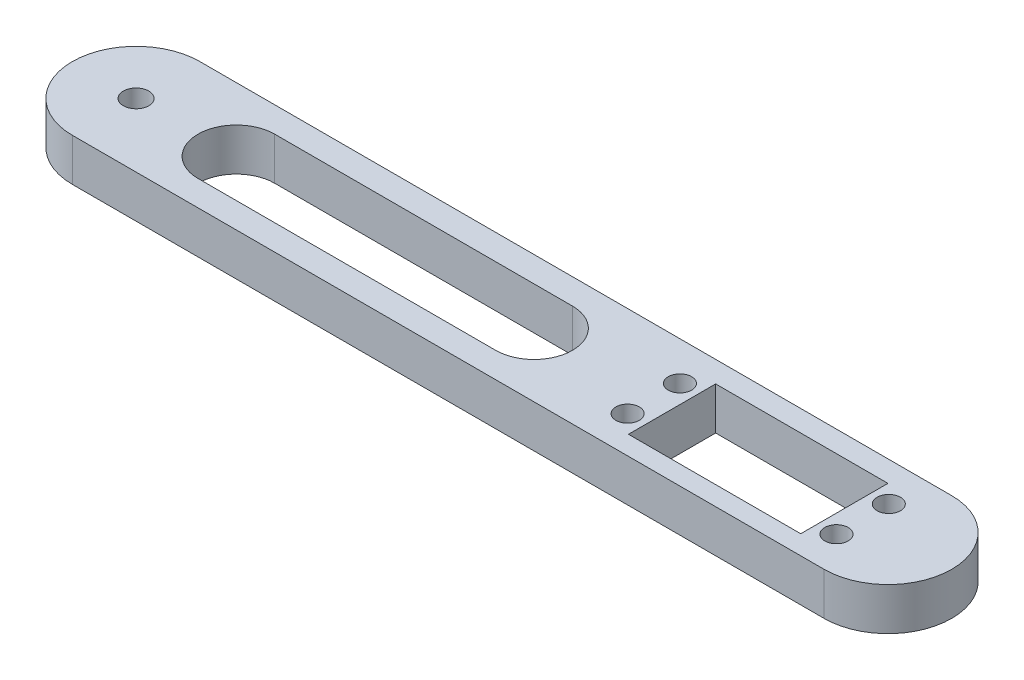
ISO-10303-21;
HEADER;
FILE_DESCRIPTION(('STEP AP214'),'2;1');
FILE_NAME('part.step','',(''),(''),'','','');
FILE_SCHEMA(('AUTOMOTIVE_DESIGN { 1 0 10303 214 1 1 1 1 }'));
ENDSEC;
DATA;
#1=APPLICATION_CONTEXT('core data for automotive mechanical design processes');
#2=APPLICATION_PROTOCOL_DEFINITION('international standard','automotive_design',2000,#1);
#3=PRODUCT_CONTEXT('',#1,'mechanical');
#4=PRODUCT('Part','Part','',(#3));
#5=PRODUCT_RELATED_PRODUCT_CATEGORY('part','',(#4));
#6=PRODUCT_DEFINITION_FORMATION('','',#4);
#7=PRODUCT_DEFINITION_CONTEXT('part definition',#1,'design');
#8=PRODUCT_DEFINITION('design','',#6,#7);
#9=PRODUCT_DEFINITION_SHAPE('','',#8);
#10=(LENGTH_UNIT() NAMED_UNIT(*) SI_UNIT(.MILLI.,.METRE.));
#11=(NAMED_UNIT(*) PLANE_ANGLE_UNIT() SI_UNIT($,.RADIAN.));
#12=(NAMED_UNIT(*) SI_UNIT($,.STERADIAN.) SOLID_ANGLE_UNIT());
#13=UNCERTAINTY_MEASURE_WITH_UNIT(LENGTH_MEASURE(1.E-05),#10,'distance_accuracy_value','');
#14=(GEOMETRIC_REPRESENTATION_CONTEXT(3) GLOBAL_UNCERTAINTY_ASSIGNED_CONTEXT((#13)) GLOBAL_UNIT_ASSIGNED_CONTEXT((#10,
#11,#12)) REPRESENTATION_CONTEXT('',''));
#15=CARTESIAN_POINT('',(0.,0.,0.));
#16=DIRECTION('',(0.,0.,1.));
#17=DIRECTION('',(1.,0.,0.));
#18=AXIS2_PLACEMENT_3D('',#15,#16,#17);
#19=CARTESIAN_POINT('',(0.,10.,0.));
#20=DIRECTION('',(0.,1.,0.));
#21=DIRECTION('',(0.,0.,1.));
#22=AXIS2_PLACEMENT_3D('',#19,#20,#21);
#23=PLANE('',#22);
#24=CARTESIAN_POINT('',(45.2012500312515,10.,-5.9));
#25=DIRECTION('',(0.,1.,0.));
#26=DIRECTION('',(0.,0.,1.));
#27=AXIS2_PLACEMENT_3D('',#24,#25,#26);
#28=CIRCLE('',#27,2.75);
#29=CARTESIAN_POINT('',(45.2012500312515,10.,-3.15));
#30=VERTEX_POINT('',#29);
#31=EDGE_CURVE('E380',#30,#30,#28,.T.);
#32=ORIENTED_EDGE('',*,*,#31,.F.);
#33=EDGE_LOOP('',(#32));
#34=FACE_BOUND('',#33,.T.);
#35=CARTESIAN_POINT('',(45.2012500312515,10.,6.4));
#36=DIRECTION('',(0.,1.,0.));
#37=DIRECTION('',(0.,0.,1.));
#38=AXIS2_PLACEMENT_3D('',#35,#36,#37);
#39=CIRCLE('',#38,2.75);
#40=CARTESIAN_POINT('',(45.2012500312515,10.,9.15));
#41=VERTEX_POINT('',#40);
#42=EDGE_CURVE('E157',#41,#41,#39,.T.);
#43=ORIENTED_EDGE('',*,*,#42,.F.);
#44=EDGE_LOOP('',(#43));
#45=FACE_BOUND('',#44,.T.);
#46=DIRECTION('',(0.,0.,1.));
#47=VECTOR('',#46,1.);
#48=CARTESIAN_POINT('',(49.5012500312515,10.,-10.));
#49=LINE('',#48,#47);
#50=CARTESIAN_POINT('',(49.5012500312515,10.,-10.));
#51=VERTEX_POINT('',#50);
#52=CARTESIAN_POINT('',(49.5012500312516,10.,10.5));
#53=VERTEX_POINT('',#52);
#54=EDGE_CURVE('E55',#51,#53,#49,.T.);
#55=ORIENTED_EDGE('',*,*,#54,.F.);
#56=DIRECTION('',(-1.,0.,0.));
#57=VECTOR('',#56,1.);
#58=CARTESIAN_POINT('',(49.5012500312515,10.,-10.));
#59=LINE('',#58,#57);
#60=CARTESIAN_POINT('',(90.0012500312516,10.,-10.));
#61=VERTEX_POINT('',#60);
#62=EDGE_CURVE('E150',#61,#51,#59,.T.);
#63=ORIENTED_EDGE('',*,*,#62,.F.);
#64=DIRECTION('',(0.,0.,-1.));
#65=VECTOR('',#64,1.);
#66=CARTESIAN_POINT('',(90.0012500312516,10.,-10.));
#67=LINE('',#66,#65);
#68=CARTESIAN_POINT('',(90.0012500312516,10.,10.5));
#69=VERTEX_POINT('',#68);
#70=EDGE_CURVE('E154',#69,#61,#67,.T.);
#71=ORIENTED_EDGE('',*,*,#70,.F.);
#72=DIRECTION('',(1.,0.,0.));
#73=VECTOR('',#72,1.);
#74=CARTESIAN_POINT('',(49.5012500312516,10.,10.5));
#75=LINE('',#74,#73);
#76=EDGE_CURVE('E166',#53,#69,#75,.T.);
#77=ORIENTED_EDGE('',*,*,#76,.F.);
#78=EDGE_LOOP('',(#55,#63,#71,#77));
#79=FACE_BOUND('',#78,.T.);
#80=CARTESIAN_POINT('',(94.3012500312516,10.,-5.9));
#81=DIRECTION('',(0.,1.,0.));
#82=DIRECTION('',(0.,0.,1.));
#83=AXIS2_PLACEMENT_3D('',#80,#81,#82);
#84=CIRCLE('',#83,2.75000000000001);
#85=CARTESIAN_POINT('',(94.3012500312516,10.,-3.14999999999999));
#86=VERTEX_POINT('',#85);
#87=EDGE_CURVE('E185',#86,#86,#84,.T.);
#88=ORIENTED_EDGE('',*,*,#87,.F.);
#89=EDGE_LOOP('',(#88));
#90=FACE_BOUND('',#89,.T.);
#91=CARTESIAN_POINT('',(94.3012500312516,10.,6.4));
#92=DIRECTION('',(0.,1.,0.));
#93=DIRECTION('',(0.,0.,1.));
#94=AXIS2_PLACEMENT_3D('',#91,#92,#93);
#95=CIRCLE('',#94,2.75000000000001);
#96=CARTESIAN_POINT('',(94.3012500312516,10.,9.15000000000001));
#97=VERTEX_POINT('',#96);
#98=EDGE_CURVE('E193',#97,#97,#95,.T.);
#99=ORIENTED_EDGE('',*,*,#98,.F.);
#100=EDGE_LOOP('',(#99));
#101=FACE_BOUND('',#100,.T.);
#102=CARTESIAN_POINT('',(-76.7563514393824,10.,0.));
#103=DIRECTION('',(0.,1.,0.));
#104=DIRECTION('',(0.,0.,1.));
#105=AXIS2_PLACEMENT_3D('',#102,#103,#104);
#106=CIRCLE('',#105,3.00000000000001);
#107=CARTESIAN_POINT('',(-76.7563514393824,10.,3.00000000000001));
#108=VERTEX_POINT('',#107);
#109=EDGE_CURVE('E176',#108,#108,#106,.T.);
#110=ORIENTED_EDGE('',*,*,#109,.F.);
#111=EDGE_LOOP('',(#110));
#112=FACE_BOUND('',#111,.T.);
#113=CARTESIAN_POINT('',(-53.1808797610856,10.,0.));
#114=DIRECTION('',(0.,1.,0.));
#115=DIRECTION('',(0.,0.,1.));
#116=AXIS2_PLACEMENT_3D('',#113,#114,#115);
#117=CIRCLE('',#116,9.01817655626148);
#118=CARTESIAN_POINT('',(-53.1808797610856,10.,-9.01817655626148));
#119=VERTEX_POINT('',#118);
#120=CARTESIAN_POINT('',(-53.1808797610856,10.,9.01817655626148));
#121=VERTEX_POINT('',#120);
#122=EDGE_CURVE('E202',#119,#121,#117,.T.);
#123=ORIENTED_EDGE('',*,*,#122,.F.);
#124=DIRECTION('',(-1.,0.,0.));
#125=VECTOR('',#124,1.);
#126=CARTESIAN_POINT('',(-53.1808797610856,10.,-9.01817655626148));
#127=LINE('',#126,#125);
#128=CARTESIAN_POINT('',(16.8191202389144,10.,-9.01817655626148));
#129=VERTEX_POINT('',#128);
#130=EDGE_CURVE('E211',#129,#119,#127,.T.);
#131=ORIENTED_EDGE('',*,*,#130,.F.);
#132=CARTESIAN_POINT('',(16.8191202389144,10.,0.));
#133=DIRECTION('',(0.,1.,0.));
#134=DIRECTION('',(0.,0.,1.));
#135=AXIS2_PLACEMENT_3D('',#132,#133,#134);
#136=CIRCLE('',#135,9.01817655626148);
#137=CARTESIAN_POINT('',(16.8191202389144,10.,9.01817655626148));
#138=VERTEX_POINT('',#137);
#139=EDGE_CURVE('E230',#138,#129,#136,.T.);
#140=ORIENTED_EDGE('',*,*,#139,.F.);
#141=DIRECTION('',(1.,0.,0.));
#142=VECTOR('',#141,1.);
#143=CARTESIAN_POINT('',(-53.1808797610856,10.,9.01817655626148));
#144=LINE('',#143,#142);
#145=EDGE_CURVE('E226',#121,#138,#144,.T.);
#146=ORIENTED_EDGE('',*,*,#145,.F.);
#147=EDGE_LOOP('',(#123,#131,#140,#146));
#148=FACE_BOUND('',#147,.T.);
#149=DIRECTION('',(-1.,0.,0.));
#150=VECTOR('',#149,1.);
#151=CARTESIAN_POINT('',(0.,10.,-15.));
#152=LINE('',#151,#150);
#153=CARTESIAN_POINT('',(100.,10.,-15.));
#154=VERTEX_POINT('',#153);
#155=CARTESIAN_POINT('',(-76.7563514393824,10.,-15.));
#156=VERTEX_POINT('',#155);
#157=EDGE_CURVE('E273',#154,#156,#152,.T.);
#158=ORIENTED_EDGE('',*,*,#157,.T.);
#159=CARTESIAN_POINT('',(-76.7563514393824,10.,0.));
#160=DIRECTION('',(0.,1.,0.));
#161=DIRECTION('',(0.,0.,1.));
#162=AXIS2_PLACEMENT_3D('',#159,#160,#161);
#163=CIRCLE('',#162,15.);
#164=CARTESIAN_POINT('',(-76.7563514393824,10.,15.));
#165=VERTEX_POINT('',#164);
#166=EDGE_CURVE('E240',#156,#165,#163,.T.);
#167=ORIENTED_EDGE('',*,*,#166,.T.);
#168=DIRECTION('',(1.,0.,0.));
#169=VECTOR('',#168,1.);
#170=CARTESIAN_POINT('',(0.,10.,15.));
#171=LINE('',#170,#169);
#172=CARTESIAN_POINT('',(100.,10.,15.));
#173=VERTEX_POINT('',#172);
#174=EDGE_CURVE('E266',#165,#173,#171,.T.);
#175=ORIENTED_EDGE('',*,*,#174,.T.);
#176=CARTESIAN_POINT('',(100.,10.,0.));
#177=DIRECTION('',(0.,1.,0.));
#178=DIRECTION('',(0.,0.,1.));
#179=AXIS2_PLACEMENT_3D('',#176,#177,#178);
#180=CIRCLE('',#179,15.);
#181=EDGE_CURVE('E269',#173,#154,#180,.T.);
#182=ORIENTED_EDGE('',*,*,#181,.T.);
#183=EDGE_LOOP('',(#158,#167,#175,#182));
#184=FACE_BOUND('',#183,.T.);
#185=ADVANCED_FACE('F39',(#34,#45,#79,#90,#101,#112,#148,#184),#23,.T.);
#186=CARTESIAN_POINT('',(0.,0.,0.));
#187=DIRECTION('',(0.,1.,0.));
#188=DIRECTION('',(0.,0.,1.));
#189=AXIS2_PLACEMENT_3D('',#186,#187,#188);
#190=PLANE('',#189);
#191=CARTESIAN_POINT('',(45.2012500312515,0.,-5.9));
#192=DIRECTION('',(0.,1.,0.));
#193=DIRECTION('',(0.,0.,1.));
#194=AXIS2_PLACEMENT_3D('',#191,#192,#193);
#195=CIRCLE('',#194,2.75);
#196=CARTESIAN_POINT('',(45.2012500312515,0.,-3.15));
#197=VERTEX_POINT('',#196);
#198=EDGE_CURVE('E197',#197,#197,#195,.T.);
#199=ORIENTED_EDGE('',*,*,#198,.T.);
#200=EDGE_LOOP('',(#199));
#201=FACE_BOUND('',#200,.T.);
#202=CARTESIAN_POINT('',(45.2012500312515,0.,6.4));
#203=DIRECTION('',(0.,1.,0.));
#204=DIRECTION('',(0.,0.,1.));
#205=AXIS2_PLACEMENT_3D('',#202,#203,#204);
#206=CIRCLE('',#205,2.75);
#207=CARTESIAN_POINT('',(45.2012500312515,0.,9.15));
#208=VERTEX_POINT('',#207);
#209=EDGE_CURVE('E382',#208,#208,#206,.T.);
#210=ORIENTED_EDGE('',*,*,#209,.T.);
#211=EDGE_LOOP('',(#210));
#212=FACE_BOUND('',#211,.T.);
#213=DIRECTION('',(-1.,0.,0.));
#214=VECTOR('',#213,1.);
#215=CARTESIAN_POINT('',(49.5012500312515,0.,-10.));
#216=LINE('',#215,#214);
#217=CARTESIAN_POINT('',(90.0012500312516,0.,-10.));
#218=VERTEX_POINT('',#217);
#219=CARTESIAN_POINT('',(49.5012500312515,0.,-10.));
#220=VERTEX_POINT('',#219);
#221=EDGE_CURVE('E138',#218,#220,#216,.T.);
#222=ORIENTED_EDGE('',*,*,#221,.T.);
#223=DIRECTION('',(0.,0.,1.));
#224=VECTOR('',#223,1.);
#225=CARTESIAN_POINT('',(49.5012500312515,0.,-10.));
#226=LINE('',#225,#224);
#227=CARTESIAN_POINT('',(49.5012500312516,0.,10.5));
#228=VERTEX_POINT('',#227);
#229=EDGE_CURVE('E131',#220,#228,#226,.T.);
#230=ORIENTED_EDGE('',*,*,#229,.T.);
#231=DIRECTION('',(1.,0.,0.));
#232=VECTOR('',#231,1.);
#233=CARTESIAN_POINT('',(49.5012500312516,0.,10.5));
#234=LINE('',#233,#232);
#235=CARTESIAN_POINT('',(90.0012500312516,0.,10.5));
#236=VERTEX_POINT('',#235);
#237=EDGE_CURVE('E141',#228,#236,#234,.T.);
#238=ORIENTED_EDGE('',*,*,#237,.T.);
#239=DIRECTION('',(0.,0.,-1.));
#240=VECTOR('',#239,1.);
#241=CARTESIAN_POINT('',(90.0012500312516,0.,-10.));
#242=LINE('',#241,#240);
#243=EDGE_CURVE('E63',#236,#218,#242,.T.);
#244=ORIENTED_EDGE('',*,*,#243,.T.);
#245=EDGE_LOOP('',(#222,#230,#238,#244));
#246=FACE_BOUND('',#245,.T.);
#247=CARTESIAN_POINT('',(94.3012500312516,0.,-5.9));
#248=DIRECTION('',(0.,1.,0.));
#249=DIRECTION('',(0.,0.,1.));
#250=AXIS2_PLACEMENT_3D('',#247,#248,#249);
#251=CIRCLE('',#250,2.75000000000001);
#252=CARTESIAN_POINT('',(94.3012500312516,0.,-3.14999999999999));
#253=VERTEX_POINT('',#252);
#254=EDGE_CURVE('E167',#253,#253,#251,.T.);
#255=ORIENTED_EDGE('',*,*,#254,.T.);
#256=EDGE_LOOP('',(#255));
#257=FACE_BOUND('',#256,.T.);
#258=CARTESIAN_POINT('',(94.3012500312516,0.,6.4));
#259=DIRECTION('',(0.,1.,0.));
#260=DIRECTION('',(0.,0.,1.));
#261=AXIS2_PLACEMENT_3D('',#258,#259,#260);
#262=CIRCLE('',#261,2.75000000000001);
#263=CARTESIAN_POINT('',(94.3012500312516,0.,9.15000000000001));
#264=VERTEX_POINT('',#263);
#265=EDGE_CURVE('E189',#264,#264,#262,.T.);
#266=ORIENTED_EDGE('',*,*,#265,.T.);
#267=EDGE_LOOP('',(#266));
#268=FACE_BOUND('',#267,.T.);
#269=CARTESIAN_POINT('',(-76.7563514393824,0.,0.));
#270=DIRECTION('',(0.,1.,0.));
#271=DIRECTION('',(0.,0.,1.));
#272=AXIS2_PLACEMENT_3D('',#269,#270,#271);
#273=CIRCLE('',#272,3.00000000000001);
#274=CARTESIAN_POINT('',(-76.7563514393824,0.,3.00000000000001));
#275=VERTEX_POINT('',#274);
#276=EDGE_CURVE('E198',#275,#275,#273,.T.);
#277=ORIENTED_EDGE('',*,*,#276,.T.);
#278=EDGE_LOOP('',(#277));
#279=FACE_BOUND('',#278,.T.);
#280=DIRECTION('',(-1.,0.,0.));
#281=VECTOR('',#280,1.);
#282=CARTESIAN_POINT('',(-53.1808797610856,0.,-9.01817655626148));
#283=LINE('',#282,#281);
#284=CARTESIAN_POINT('',(16.8191202389144,0.,-9.01817655626148));
#285=VERTEX_POINT('',#284);
#286=CARTESIAN_POINT('',(-53.1808797610856,0.,-9.01817655626148));
#287=VERTEX_POINT('',#286);
#288=EDGE_CURVE('E219',#285,#287,#283,.T.);
#289=ORIENTED_EDGE('',*,*,#288,.T.);
#290=CARTESIAN_POINT('',(-53.1808797610856,0.,0.));
#291=DIRECTION('',(0.,1.,0.));
#292=DIRECTION('',(0.,0.,1.));
#293=AXIS2_PLACEMENT_3D('',#290,#291,#292);
#294=CIRCLE('',#293,9.01817655626148);
#295=CARTESIAN_POINT('',(-53.1808797610856,0.,9.01817655626148));
#296=VERTEX_POINT('',#295);
#297=EDGE_CURVE('E206',#287,#296,#294,.T.);
#298=ORIENTED_EDGE('',*,*,#297,.T.);
#299=DIRECTION('',(1.,0.,0.));
#300=VECTOR('',#299,1.);
#301=CARTESIAN_POINT('',(-53.1808797610856,0.,9.01817655626148));
#302=LINE('',#301,#300);
#303=CARTESIAN_POINT('',(16.8191202389144,0.,9.01817655626148));
#304=VERTEX_POINT('',#303);
#305=EDGE_CURVE('E210',#296,#304,#302,.T.);
#306=ORIENTED_EDGE('',*,*,#305,.T.);
#307=CARTESIAN_POINT('',(16.8191202389144,0.,0.));
#308=DIRECTION('',(0.,1.,0.));
#309=DIRECTION('',(0.,0.,1.));
#310=AXIS2_PLACEMENT_3D('',#307,#308,#309);
#311=CIRCLE('',#310,9.01817655626148);
#312=EDGE_CURVE('E215',#304,#285,#311,.T.);
#313=ORIENTED_EDGE('',*,*,#312,.T.);
#314=EDGE_LOOP('',(#289,#298,#306,#313));
#315=FACE_BOUND('',#314,.T.);
#316=CARTESIAN_POINT('',(100.,0.,0.));
#317=DIRECTION('',(0.,1.,0.));
#318=DIRECTION('',(0.,0.,1.));
#319=AXIS2_PLACEMENT_3D('',#316,#317,#318);
#320=CIRCLE('',#319,15.);
#321=CARTESIAN_POINT('',(100.,0.,15.));
#322=VERTEX_POINT('',#321);
#323=CARTESIAN_POINT('',(100.,0.,-15.));
#324=VERTEX_POINT('',#323);
#325=EDGE_CURVE('E278',#322,#324,#320,.T.);
#326=ORIENTED_EDGE('',*,*,#325,.F.);
#327=DIRECTION('',(1.,0.,0.));
#328=VECTOR('',#327,1.);
#329=CARTESIAN_POINT('',(0.,0.,15.));
#330=LINE('',#329,#328);
#331=CARTESIAN_POINT('',(-76.7563514393824,0.,15.));
#332=VERTEX_POINT('',#331);
#333=EDGE_CURVE('E262',#332,#322,#330,.T.);
#334=ORIENTED_EDGE('',*,*,#333,.F.);
#335=CARTESIAN_POINT('',(-76.7563514393824,0.,0.));
#336=DIRECTION('',(0.,1.,0.));
#337=DIRECTION('',(0.,0.,1.));
#338=AXIS2_PLACEMENT_3D('',#335,#336,#337);
#339=CIRCLE('',#338,15.);
#340=CARTESIAN_POINT('',(-76.7563514393824,0.,-15.));
#341=VERTEX_POINT('',#340);
#342=EDGE_CURVE('E250',#341,#332,#339,.T.);
#343=ORIENTED_EDGE('',*,*,#342,.F.);
#344=DIRECTION('',(-1.,0.,0.));
#345=VECTOR('',#344,1.);
#346=CARTESIAN_POINT('',(0.,0.,-15.));
#347=LINE('',#346,#345);
#348=EDGE_CURVE('E270',#324,#341,#347,.T.);
#349=ORIENTED_EDGE('',*,*,#348,.F.);
#350=EDGE_LOOP('',(#326,#334,#343,#349));
#351=FACE_BOUND('',#350,.T.);
#352=ADVANCED_FACE('F146',(#201,#212,#246,#257,#268,#279,#315,#351),#190,.F.);
#353=CARTESIAN_POINT('',(0.,10.,15.));
#354=DIRECTION('',(0.,0.,-1.));
#355=DIRECTION('',(-1.,0.,0.));
#356=AXIS2_PLACEMENT_3D('',#353,#354,#355);
#357=PLANE('',#356);
#358=ORIENTED_EDGE('',*,*,#333,.T.);
#359=DIRECTION('',(0.,-1.,0.));
#360=VECTOR('',#359,1.);
#361=CARTESIAN_POINT('',(100.,10.,15.));
#362=LINE('',#361,#360);
#363=EDGE_CURVE('E11',#173,#322,#362,.T.);
#364=ORIENTED_EDGE('',*,*,#363,.F.);
#365=ORIENTED_EDGE('',*,*,#174,.F.);
#366=DIRECTION('',(0.,1.,0.));
#367=VECTOR('',#366,1.);
#368=CARTESIAN_POINT('',(-76.7563514393824,0.,15.));
#369=LINE('',#368,#367);
#370=EDGE_CURVE('E254',#332,#165,#369,.T.);
#371=ORIENTED_EDGE('',*,*,#370,.F.);
#372=EDGE_LOOP('',(#358,#364,#365,#371));
#373=FACE_BOUND('',#372,.T.);
#374=ADVANCED_FACE('F41',(#373),#357,.F.);
#375=CARTESIAN_POINT('',(100.,10.,0.));
#376=DIRECTION('',(0.,-1.,0.));
#377=DIRECTION('',(0.,0.,-1.));
#378=AXIS2_PLACEMENT_3D('',#375,#376,#377);
#379=CYLINDRICAL_SURFACE('',#378,15.);
#380=ORIENTED_EDGE('',*,*,#325,.T.);
#381=DIRECTION('',(0.,-1.,0.));
#382=VECTOR('',#381,1.);
#383=CARTESIAN_POINT('',(100.,10.,-15.));
#384=LINE('',#383,#382);
#385=EDGE_CURVE('E48',#154,#324,#384,.T.);
#386=ORIENTED_EDGE('',*,*,#385,.F.);
#387=ORIENTED_EDGE('',*,*,#181,.F.);
#388=ORIENTED_EDGE('',*,*,#363,.T.);
#389=EDGE_LOOP('',(#380,#386,#387,#388));
#390=FACE_BOUND('',#389,.T.);
#391=ADVANCED_FACE('F301',(#390),#379,.T.);
#392=CARTESIAN_POINT('',(0.,10.,-15.));
#393=DIRECTION('',(0.,0.,1.));
#394=DIRECTION('',(1.,0.,0.));
#395=AXIS2_PLACEMENT_3D('',#392,#393,#394);
#396=PLANE('',#395);
#397=ORIENTED_EDGE('',*,*,#348,.T.);
#398=DIRECTION('',(0.,1.,0.));
#399=VECTOR('',#398,1.);
#400=CARTESIAN_POINT('',(-76.7563514393824,0.,-15.));
#401=LINE('',#400,#399);
#402=EDGE_CURVE('E258',#341,#156,#401,.T.);
#403=ORIENTED_EDGE('',*,*,#402,.T.);
#404=ORIENTED_EDGE('',*,*,#157,.F.);
#405=ORIENTED_EDGE('',*,*,#385,.T.);
#406=EDGE_LOOP('',(#397,#403,#404,#405));
#407=FACE_BOUND('',#406,.T.);
#408=ADVANCED_FACE('F288',(#407),#396,.F.);
#409=CARTESIAN_POINT('',(-76.7563514393824,0.,0.));
#410=DIRECTION('',(0.,1.,0.));
#411=DIRECTION('',(0.,0.,1.));
#412=AXIS2_PLACEMENT_3D('',#409,#410,#411);
#413=CYLINDRICAL_SURFACE('',#412,15.);
#414=ORIENTED_EDGE('',*,*,#166,.F.);
#415=ORIENTED_EDGE('',*,*,#402,.F.);
#416=ORIENTED_EDGE('',*,*,#342,.T.);
#417=ORIENTED_EDGE('',*,*,#370,.T.);
#418=EDGE_LOOP('',(#414,#415,#416,#417));
#419=FACE_BOUND('',#418,.T.);
#420=ADVANCED_FACE('F298',(#419),#413,.T.);
#421=CARTESIAN_POINT('',(-53.1808797610856,0.,0.));
#422=DIRECTION('',(0.,1.,0.));
#423=DIRECTION('',(0.,0.,1.));
#424=AXIS2_PLACEMENT_3D('',#421,#422,#423);
#425=CYLINDRICAL_SURFACE('',#424,9.01817655626148);
#426=ORIENTED_EDGE('',*,*,#122,.T.);
#427=DIRECTION('',(0.,1.,0.));
#428=VECTOR('',#427,1.);
#429=CARTESIAN_POINT('',(-53.1808797610856,0.,9.01817655626148));
#430=LINE('',#429,#428);
#431=EDGE_CURVE('E223',#296,#121,#430,.T.);
#432=ORIENTED_EDGE('',*,*,#431,.F.);
#433=ORIENTED_EDGE('',*,*,#297,.F.);
#434=DIRECTION('',(0.,1.,0.));
#435=VECTOR('',#434,1.);
#436=CARTESIAN_POINT('',(-53.1808797610856,0.,-9.01817655626148));
#437=LINE('',#436,#435);
#438=EDGE_CURVE('E237',#287,#119,#437,.T.);
#439=ORIENTED_EDGE('',*,*,#438,.T.);
#440=EDGE_LOOP('',(#426,#432,#433,#439));
#441=FACE_BOUND('',#440,.T.);
#442=ADVANCED_FACE('F324',(#441),#425,.F.);
#443=CARTESIAN_POINT('',(-53.1808797610856,0.,-9.01817655626148));
#444=DIRECTION('',(0.,0.,-1.));
#445=DIRECTION('',(-1.,0.,0.));
#446=AXIS2_PLACEMENT_3D('',#443,#444,#445);
#447=PLANE('',#446);
#448=ORIENTED_EDGE('',*,*,#130,.T.);
#449=ORIENTED_EDGE('',*,*,#438,.F.);
#450=ORIENTED_EDGE('',*,*,#288,.F.);
#451=DIRECTION('',(0.,1.,0.));
#452=VECTOR('',#451,1.);
#453=CARTESIAN_POINT('',(16.8191202389144,0.,-9.01817655626148));
#454=LINE('',#453,#452);
#455=EDGE_CURVE('E241',#285,#129,#454,.T.);
#456=ORIENTED_EDGE('',*,*,#455,.T.);
#457=EDGE_LOOP('',(#448,#449,#450,#456));
#458=FACE_BOUND('',#457,.T.);
#459=ADVANCED_FACE('F328',(#458),#447,.F.);
#460=CARTESIAN_POINT('',(16.8191202389144,0.,0.));
#461=DIRECTION('',(0.,1.,0.));
#462=DIRECTION('',(0.,0.,1.));
#463=AXIS2_PLACEMENT_3D('',#460,#461,#462);
#464=CYLINDRICAL_SURFACE('',#463,9.01817655626148);
#465=ORIENTED_EDGE('',*,*,#139,.T.);
#466=ORIENTED_EDGE('',*,*,#455,.F.);
#467=ORIENTED_EDGE('',*,*,#312,.F.);
#468=DIRECTION('',(0.,1.,0.));
#469=VECTOR('',#468,1.);
#470=CARTESIAN_POINT('',(16.8191202389144,0.,9.01817655626148));
#471=LINE('',#470,#469);
#472=EDGE_CURVE('E244',#304,#138,#471,.T.);
#473=ORIENTED_EDGE('',*,*,#472,.T.);
#474=EDGE_LOOP('',(#465,#466,#467,#473));
#475=FACE_BOUND('',#474,.T.);
#476=ADVANCED_FACE('F333',(#475),#464,.F.);
#477=CARTESIAN_POINT('',(-53.1808797610856,0.,9.01817655626148));
#478=DIRECTION('',(0.,0.,1.));
#479=DIRECTION('',(1.,0.,0.));
#480=AXIS2_PLACEMENT_3D('',#477,#478,#479);
#481=PLANE('',#480);
#482=ORIENTED_EDGE('',*,*,#145,.T.);
#483=ORIENTED_EDGE('',*,*,#472,.F.);
#484=ORIENTED_EDGE('',*,*,#305,.F.);
#485=ORIENTED_EDGE('',*,*,#431,.T.);
#486=EDGE_LOOP('',(#482,#483,#484,#485));
#487=FACE_BOUND('',#486,.T.);
#488=ADVANCED_FACE('F337',(#487),#481,.F.);
#489=CARTESIAN_POINT('',(-76.7563514393824,0.,0.));
#490=DIRECTION('',(0.,1.,0.));
#491=DIRECTION('',(0.,0.,1.));
#492=AXIS2_PLACEMENT_3D('',#489,#490,#491);
#493=CYLINDRICAL_SURFACE('',#492,3.00000000000001);
#494=ORIENTED_EDGE('',*,*,#276,.F.);
#495=EDGE_LOOP('',(#494));
#496=FACE_BOUND('',#495,.T.);
#497=ORIENTED_EDGE('',*,*,#109,.T.);
#498=EDGE_LOOP('',(#497));
#499=FACE_BOUND('',#498,.T.);
#500=ADVANCED_FACE('F340',(#496,#499),#493,.F.);
#501=CARTESIAN_POINT('',(94.3012500312516,0.,6.4));
#502=DIRECTION('',(0.,1.,0.));
#503=DIRECTION('',(0.,0.,1.));
#504=AXIS2_PLACEMENT_3D('',#501,#502,#503);
#505=CYLINDRICAL_SURFACE('',#504,2.75000000000001);
#506=ORIENTED_EDGE('',*,*,#265,.F.);
#507=EDGE_LOOP('',(#506));
#508=FACE_BOUND('',#507,.T.);
#509=ORIENTED_EDGE('',*,*,#98,.T.);
#510=EDGE_LOOP('',(#509));
#511=FACE_BOUND('',#510,.T.);
#512=ADVANCED_FACE('F347',(#508,#511),#505,.F.);
#513=CARTESIAN_POINT('',(94.3012500312516,0.,-5.9));
#514=DIRECTION('',(0.,1.,0.));
#515=DIRECTION('',(0.,0.,1.));
#516=AXIS2_PLACEMENT_3D('',#513,#514,#515);
#517=CYLINDRICAL_SURFACE('',#516,2.75000000000001);
#518=ORIENTED_EDGE('',*,*,#254,.F.);
#519=EDGE_LOOP('',(#518));
#520=FACE_BOUND('',#519,.T.);
#521=ORIENTED_EDGE('',*,*,#87,.T.);
#522=EDGE_LOOP('',(#521));
#523=FACE_BOUND('',#522,.T.);
#524=ADVANCED_FACE('F351',(#520,#523),#517,.F.);
#525=CARTESIAN_POINT('',(49.5012500312515,0.,-10.));
#526=DIRECTION('',(-1.,0.,0.));
#527=DIRECTION('',(0.,0.,1.));
#528=AXIS2_PLACEMENT_3D('',#525,#526,#527);
#529=PLANE('',#528);
#530=ORIENTED_EDGE('',*,*,#54,.T.);
#531=DIRECTION('',(0.,1.,0.));
#532=VECTOR('',#531,1.);
#533=CARTESIAN_POINT('',(49.5012500312516,0.,10.5));
#534=LINE('',#533,#532);
#535=EDGE_CURVE('E127',#228,#53,#534,.T.);
#536=ORIENTED_EDGE('',*,*,#535,.F.);
#537=ORIENTED_EDGE('',*,*,#229,.F.);
#538=DIRECTION('',(0.,1.,0.));
#539=VECTOR('',#538,1.);
#540=CARTESIAN_POINT('',(49.5012500312515,0.,-10.));
#541=LINE('',#540,#539);
#542=EDGE_CURVE('E173',#220,#51,#541,.T.);
#543=ORIENTED_EDGE('',*,*,#542,.T.);
#544=EDGE_LOOP('',(#530,#536,#537,#543));
#545=FACE_BOUND('',#544,.T.);
#546=ADVANCED_FACE('F129',(#545),#529,.F.);
#547=CARTESIAN_POINT('',(49.5012500312515,0.,-10.));
#548=DIRECTION('',(0.,0.,-1.));
#549=DIRECTION('',(-1.,0.,0.));
#550=AXIS2_PLACEMENT_3D('',#547,#548,#549);
#551=PLANE('',#550);
#552=ORIENTED_EDGE('',*,*,#62,.T.);
#553=ORIENTED_EDGE('',*,*,#542,.F.);
#554=ORIENTED_EDGE('',*,*,#221,.F.);
#555=DIRECTION('',(0.,1.,0.));
#556=VECTOR('',#555,1.);
#557=CARTESIAN_POINT('',(90.0012500312516,0.,-10.));
#558=LINE('',#557,#556);
#559=EDGE_CURVE('E177',#218,#61,#558,.T.);
#560=ORIENTED_EDGE('',*,*,#559,.T.);
#561=EDGE_LOOP('',(#552,#553,#554,#560));
#562=FACE_BOUND('',#561,.T.);
#563=ADVANCED_FACE('F358',(#562),#551,.F.);
#564=CARTESIAN_POINT('',(90.0012500312516,0.,-10.));
#565=DIRECTION('',(1.,0.,0.));
#566=DIRECTION('',(0.,0.,-1.));
#567=AXIS2_PLACEMENT_3D('',#564,#565,#566);
#568=PLANE('',#567);
#569=ORIENTED_EDGE('',*,*,#70,.T.);
#570=ORIENTED_EDGE('',*,*,#559,.F.);
#571=ORIENTED_EDGE('',*,*,#243,.F.);
#572=DIRECTION('',(0.,1.,0.));
#573=VECTOR('',#572,1.);
#574=CARTESIAN_POINT('',(90.0012500312516,0.,10.5));
#575=LINE('',#574,#573);
#576=EDGE_CURVE('E137',#236,#69,#575,.T.);
#577=ORIENTED_EDGE('',*,*,#576,.T.);
#578=EDGE_LOOP('',(#569,#570,#571,#577));
#579=FACE_BOUND('',#578,.T.);
#580=ADVANCED_FACE('F362',(#579),#568,.F.);
#581=CARTESIAN_POINT('',(49.5012500312516,0.,10.5));
#582=DIRECTION('',(0.,0.,1.));
#583=DIRECTION('',(1.,0.,0.));
#584=AXIS2_PLACEMENT_3D('',#581,#582,#583);
#585=PLANE('',#584);
#586=ORIENTED_EDGE('',*,*,#76,.T.);
#587=ORIENTED_EDGE('',*,*,#576,.F.);
#588=ORIENTED_EDGE('',*,*,#237,.F.);
#589=ORIENTED_EDGE('',*,*,#535,.T.);
#590=EDGE_LOOP('',(#586,#587,#588,#589));
#591=FACE_BOUND('',#590,.T.);
#592=ADVANCED_FACE('F142',(#591),#585,.F.);
#593=CARTESIAN_POINT('',(45.2012500312515,0.,6.4));
#594=DIRECTION('',(0.,1.,0.));
#595=DIRECTION('',(0.,0.,1.));
#596=AXIS2_PLACEMENT_3D('',#593,#594,#595);
#597=CYLINDRICAL_SURFACE('',#596,2.75);
#598=ORIENTED_EDGE('',*,*,#209,.F.);
#599=EDGE_LOOP('',(#598));
#600=FACE_BOUND('',#599,.T.);
#601=ORIENTED_EDGE('',*,*,#42,.T.);
#602=EDGE_LOOP('',(#601));
#603=FACE_BOUND('',#602,.T.);
#604=ADVANCED_FACE('F361',(#600,#603),#597,.F.);
#605=CARTESIAN_POINT('',(45.2012500312515,0.,-5.9));
#606=DIRECTION('',(0.,1.,0.));
#607=DIRECTION('',(0.,0.,1.));
#608=AXIS2_PLACEMENT_3D('',#605,#606,#607);
#609=CYLINDRICAL_SURFACE('',#608,2.75);
#610=ORIENTED_EDGE('',*,*,#198,.F.);
#611=EDGE_LOOP('',(#610));
#612=FACE_BOUND('',#611,.T.);
#613=ORIENTED_EDGE('',*,*,#31,.T.);
#614=EDGE_LOOP('',(#613));
#615=FACE_BOUND('',#614,.T.);
#616=ADVANCED_FACE('F370',(#612,#615),#609,.F.);
#617=CLOSED_SHELL('',(#185,#352,#374,#391,#408,#420,#442,#459,#476,#488,#500,#512,#524,#546,
#563,#580,#592,#604,#616));
#618=MANIFOLD_SOLID_BREP('B2',#617);
#619=ADVANCED_BREP_SHAPE_REPRESENTATION('',(#18,#618),#14);
#620=SHAPE_DEFINITION_REPRESENTATION(#9,#619);
ENDSEC;
END-ISO-10303-21;
